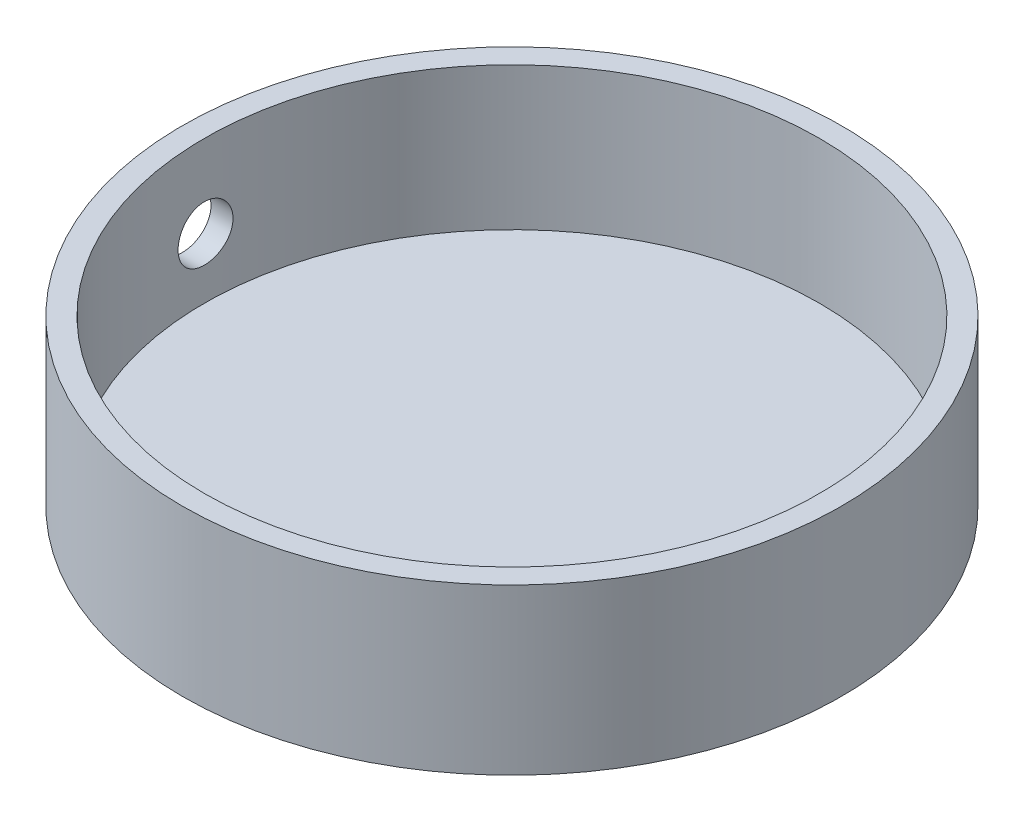
ISO-10303-21;
HEADER;
FILE_DESCRIPTION(('STEP AP214'),'2;1');
FILE_NAME('part.step','',(''),(''),'','','');
FILE_SCHEMA(('AUTOMOTIVE_DESIGN { 1 0 10303 214 1 1 1 1 }'));
ENDSEC;
DATA;
#1=APPLICATION_CONTEXT('core data for automotive mechanical design processes');
#2=APPLICATION_PROTOCOL_DEFINITION('international standard','automotive_design',2000,#1);
#3=PRODUCT_CONTEXT('',#1,'mechanical');
#4=PRODUCT('Part','Part','',(#3));
#5=PRODUCT_RELATED_PRODUCT_CATEGORY('part','',(#4));
#6=PRODUCT_DEFINITION_FORMATION('','',#4);
#7=PRODUCT_DEFINITION_CONTEXT('part definition',#1,'design');
#8=PRODUCT_DEFINITION('design','',#6,#7);
#9=PRODUCT_DEFINITION_SHAPE('','',#8);
#10=(LENGTH_UNIT() NAMED_UNIT(*) SI_UNIT(.MILLI.,.METRE.));
#11=(NAMED_UNIT(*) PLANE_ANGLE_UNIT() SI_UNIT($,.RADIAN.));
#12=(NAMED_UNIT(*) SI_UNIT($,.STERADIAN.) SOLID_ANGLE_UNIT());
#13=UNCERTAINTY_MEASURE_WITH_UNIT(LENGTH_MEASURE(1.E-05),#10,'distance_accuracy_value','');
#14=(GEOMETRIC_REPRESENTATION_CONTEXT(3) GLOBAL_UNCERTAINTY_ASSIGNED_CONTEXT((#13)) GLOBAL_UNIT_ASSIGNED_CONTEXT((#10,
#11,#12)) REPRESENTATION_CONTEXT('',''));
#15=CARTESIAN_POINT('',(0.,0.,0.));
#16=DIRECTION('',(0.,0.,1.));
#17=DIRECTION('',(1.,0.,0.));
#18=AXIS2_PLACEMENT_3D('',#15,#16,#17);
#19=CARTESIAN_POINT('',(0.,2.54,0.));
#20=DIRECTION('',(0.,-1.,0.));
#21=DIRECTION('',(0.,0.,-1.));
#22=AXIS2_PLACEMENT_3D('',#19,#20,#21);
#23=CYLINDRICAL_SURFACE('',#22,38.1);
#24=CARTESIAN_POINT('',(-37.9674778593469,9.525,3.175));
#25=CARTESIAN_POINT('',(-37.9674796148514,9.34699137458613,3.174992223886));
#26=CARTESIAN_POINT('',(-37.9687432124492,9.16886156393523,3.15997936696993));
#27=CARTESIAN_POINT('',(-37.9736610260084,8.8175305603963,3.10031123355847));
#28=CARTESIAN_POINT('',(-37.9773179506743,8.64433518421718,3.05562236969804));
#29=CARTESIAN_POINT('',(-37.9866053672742,8.30801235230677,2.93790365154258));
#30=CARTESIAN_POINT('',(-37.9922347401668,8.14487924946928,2.86488986449255));
#31=CARTESIAN_POINT('',(-38.0048313657024,7.83322285520727,2.69262246744107));
#32=CARTESIAN_POINT('',(-38.0117983322355,7.68469644967991,2.59337446720523));
#33=CARTESIAN_POINT('',(-38.0263052267685,7.40604944026374,2.37118060325433));
#34=CARTESIAN_POINT('',(-38.033846422922,7.27597150383517,2.24818130945098));
#35=CARTESIAN_POINT('',(-38.0486404573867,7.03828041719418,1.98208938314658));
#36=CARTESIAN_POINT('',(-38.0558932830884,6.9306682484669,1.83899587322542));
#37=CARTESIAN_POINT('',(-38.0693053861151,6.74082149846665,1.53652297885541));
#38=CARTESIAN_POINT('',(-38.0754630672337,6.65862383289891,1.3771203474996));
#39=CARTESIAN_POINT('',(-38.0859774147697,6.52217551569877,1.04671622158357));
#40=CARTESIAN_POINT('',(-38.0903341127107,6.4679243749007,0.875714930101314));
#41=CARTESIAN_POINT('',(-38.0967467506223,6.38903191375709,0.527392252134301));
#42=CARTESIAN_POINT('',(-38.0988080535635,6.36432156419576,0.350086600537621));
#43=CARTESIAN_POINT('',(-38.1004158213116,6.34499872988893,-0.00616674500017561));
#44=CARTESIAN_POINT('',(-38.0999623328846,6.35038568544306,-0.185114408344066));
#45=CARTESIAN_POINT('',(-38.0965960392816,6.39104808966951,-0.539104051072236));
#46=CARTESIAN_POINT('',(-38.0936893421403,6.42624930712834,-0.714154623480079));
#47=CARTESIAN_POINT('',(-38.0857505953842,6.52542557930463,-1.05585407967778));
#48=CARTESIAN_POINT('',(-38.0807185255475,6.5894009077941,-1.22250288351202));
#49=CARTESIAN_POINT('',(-38.0690846412153,6.74439210910145,-1.54290446002202));
#50=CARTESIAN_POINT('',(-38.0624808988053,6.83544122685107,-1.69664107794224));
#51=CARTESIAN_POINT('',(-38.0484457872987,7.04197131601212,-1.98667794141065));
#52=CARTESIAN_POINT('',(-38.0410144014161,7.15745278300083,-2.12297783318834));
#53=CARTESIAN_POINT('',(-38.0261325057258,7.40998784685792,-2.37470621318252));
#54=CARTESIAN_POINT('',(-38.0186820064471,7.54710594594971,-2.49007000291146));
#55=CARTESIAN_POINT('',(-38.004624326273,7.83879720374434,-2.69615157657959));
#56=CARTESIAN_POINT('',(-37.9980171460728,7.9933703768359,-2.78686934020215));
#57=CARTESIAN_POINT('',(-37.9863929785793,8.31562944367547,-2.94108125458357));
#58=CARTESIAN_POINT('',(-37.9813761874431,8.48331695175639,-3.00457204753267));
#59=CARTESIAN_POINT('',(-37.9735046116394,8.82702297981192,-3.10247984731552));
#60=CARTESIAN_POINT('',(-37.9706497815191,9.00304132455762,-3.136897465381));
#61=CARTESIAN_POINT('',(-37.967432729465,9.35784636731306,-3.17560002074756));
#62=CARTESIAN_POINT('',(-37.9670630442666,9.53662315889387,-3.17997518092429));
#63=CARTESIAN_POINT('',(-37.9688384390387,9.89236764108758,-3.15870496351731));
#64=CARTESIAN_POINT('',(-37.9709834955532,10.069335348559,-3.13305986594426));
#65=CARTESIAN_POINT('',(-37.9775398735957,10.4161791796636,-3.05255231894487));
#66=CARTESIAN_POINT('',(-37.981947928906,10.5860651434328,-2.9977319743915));
#67=CARTESIAN_POINT('',(-37.9925309166027,10.9142278608699,-2.86047288657974));
#68=CARTESIAN_POINT('',(-37.9987058773396,11.072504428211,-2.77803370016694));
#69=CARTESIAN_POINT('',(-38.0121450024561,11.3733683257962,-2.58764877433316));
#70=CARTESIAN_POINT('',(-38.0194117192607,11.515917495165,-2.47964291244999));
#71=CARTESIAN_POINT('',(-38.0342069443175,11.7808944623792,-2.24127735771924));
#72=CARTESIAN_POINT('',(-38.0417354570727,11.9033219139154,-2.11091728021842));
#73=CARTESIAN_POINT('',(-38.0562282152053,12.1248881383199,-1.83115385899478));
#74=CARTESIAN_POINT('',(-38.0631910120889,12.2239682907849,-1.68170400390121));
#75=CARTESIAN_POINT('',(-38.0757469329061,12.3956251755674,-1.36823511345573));
#76=CARTESIAN_POINT('',(-38.0813400705265,12.4682021727302,-1.20421622371214));
#77=CARTESIAN_POINT('',(-38.0905198062144,12.584691881671,-0.866475212585344));
#78=CARTESIAN_POINT('',(-38.0941089410165,12.628640843588,-0.692765665902922));
#79=CARTESIAN_POINT('',(-38.0988865697221,12.6867454092692,-0.340401843535497));
#80=CARTESIAN_POINT('',(-38.1000751090659,12.7009015769738,-0.161747661511104));
#81=CARTESIAN_POINT('',(-38.0999176999798,12.6990121317669,0.19485625365699));
#82=CARTESIAN_POINT('',(-38.0985794181538,12.6830578766626,0.372806481371152));
#83=CARTESIAN_POINT('',(-38.0935339028085,12.6215909794259,0.723490780794735));
#84=CARTESIAN_POINT('',(-38.0898266660717,12.5760782971463,0.896224845419091));
#85=CARTESIAN_POINT('',(-38.0804591990999,12.4568096998615,1.23157947247479));
#86=CARTESIAN_POINT('',(-38.0747990823492,12.3830554259817,1.39420062193183));
#87=CARTESIAN_POINT('',(-38.0621590787552,12.2094077458623,1.7047672689544));
#88=CARTESIAN_POINT('',(-38.055179212783,12.1095147529846,1.85271299854823));
#89=CARTESIAN_POINT('',(-38.0406579324267,11.8860823528541,2.13019668392583));
#90=CARTESIAN_POINT('',(-38.0331149513177,11.7624753467747,2.25968012625115));
#91=CARTESIAN_POINT('',(-38.0183309031221,11.4952457142951,2.49611459932655));
#92=CARTESIAN_POINT('',(-38.0110899095966,11.3516182476868,2.60306016549813));
#93=CARTESIAN_POINT('',(-37.9977149749742,11.0481459227745,2.79152787825786));
#94=CARTESIAN_POINT('',(-37.9915831336506,10.888271181246,2.87300201198062));
#95=CARTESIAN_POINT('',(-37.981146402472,10.5571688883677,3.00784546046481));
#96=CARTESIAN_POINT('',(-37.9768394132918,10.3859546458255,3.0612470872011));
#97=CARTESIAN_POINT('',(-37.9716477099589,10.0989419425786,3.1248289611693));
#98=CARTESIAN_POINT('',(-37.9700912043147,9.98498938742769,3.14361809063546));
#99=CARTESIAN_POINT('',(-37.9680057114582,9.75570818992021,3.16870611338372));
#100=CARTESIAN_POINT('',(-37.9674767214846,9.64037955126236,3.17500504023073));
#101=CARTESIAN_POINT('',(-37.9674778593469,9.525,3.175));
#102=B_SPLINE_CURVE_WITH_KNOTS('',3,(#24,#25,#26,#27,#28,#29,#30,#31,#32,#33,#34,#35,#36,#37,
#38,#39,#40,#41,#42,#43,#44,#45,#46,#47,#48,#49,#50,#51,#52,#53,#54,#55,#56,#57,#58,#59,#60,#61,
#62,#63,#64,#65,#66,#67,#68,#69,#70,#71,#72,#73,#74,#75,#76,#77,#78,#79,#80,#81,#82,#83,#84,#85,
#86,#87,#88,#89,#90,#91,#92,#93,#94,#95,#96,#97,#98,#99,#100,#101),.UNSPECIFIED.,.T.,.F.,(4,2,2,
2,2,2,2,2,2,2,2,2,2,2,2,2,2,2,2,2,2,2,2,2,2,2,2,2,2,2,2,2,2,2,2,2,2,2,4),(0.,0.533604603517507,
1.06781417349037,1.60172115641093,2.13551406411709,2.67052206526965,3.2055534349789,
3.74135834978334,4.27715388573729,4.81169494296257,5.34622605970216,5.87943020597204,
6.41263942553356,6.94650611589526,7.4803836360617,8.01588389273743,8.55138459084428,
9.08695131145285,9.62250677207596,10.1564531576629,10.6903945629631,11.2235674807547,
11.7567489539102,12.2911969327788,12.8256541089181,13.3614392326626,13.8972190021753,
14.4323190169852,14.9674089029308,15.5008778862256,16.0343475940937,16.5677863066157,
17.1012165837663,17.6361906712906,18.1712943208452,18.7074006261176,19.2428885044878,
19.5887550320896,19.9346206302438),.UNSPECIFIED.);
#103=CARTESIAN_POINT('',(-37.9674778593469,9.525,3.175));
#104=VERTEX_POINT('',#103);
#105=EDGE_CURVE('E57',#104,#104,#102,.T.);
#106=ORIENTED_EDGE('',*,*,#105,.T.);
#107=EDGE_LOOP('',(#106));
#108=FACE_BOUND('',#107,.T.);
#109=CARTESIAN_POINT('',(0.,0.,0.));
#110=DIRECTION('',(0.,1.,0.));
#111=DIRECTION('',(0.,0.,1.));
#112=AXIS2_PLACEMENT_3D('',#109,#110,#111);
#113=CIRCLE('',#112,38.1);
#114=CARTESIAN_POINT('',(0.,0.,38.1));
#115=VERTEX_POINT('',#114);
#116=EDGE_CURVE('E44',#115,#115,#113,.T.);
#117=ORIENTED_EDGE('',*,*,#116,.T.);
#118=EDGE_LOOP('',(#117));
#119=FACE_BOUND('',#118,.T.);
#120=CARTESIAN_POINT('',(0.,19.05,0.));
#121=DIRECTION('',(0.,1.,0.));
#122=DIRECTION('',(0.,0.,1.));
#123=AXIS2_PLACEMENT_3D('',#120,#121,#122);
#124=CIRCLE('',#123,38.1);
#125=CARTESIAN_POINT('',(0.,19.05,38.1));
#126=VERTEX_POINT('',#125);
#127=EDGE_CURVE('E48',#126,#126,#124,.T.);
#128=ORIENTED_EDGE('',*,*,#127,.F.);
#129=EDGE_LOOP('',(#128));
#130=FACE_BOUND('',#129,.T.);
#131=ADVANCED_FACE('F37',(#108,#119,#130),#23,.T.);
#132=CARTESIAN_POINT('',(0.,0.,0.));
#133=DIRECTION('',(0.,1.,0.));
#134=DIRECTION('',(0.,0.,1.));
#135=AXIS2_PLACEMENT_3D('',#132,#133,#134);
#136=PLANE('',#135);
#137=ORIENTED_EDGE('',*,*,#116,.F.);
#138=EDGE_LOOP('',(#137));
#139=FACE_BOUND('',#138,.T.);
#140=ADVANCED_FACE('F84',(#139),#136,.F.);
#141=CARTESIAN_POINT('',(0.,19.05,0.));
#142=DIRECTION('',(0.,1.,0.));
#143=DIRECTION('',(0.,0.,1.));
#144=AXIS2_PLACEMENT_3D('',#141,#142,#143);
#145=PLANE('',#144);
#146=ORIENTED_EDGE('',*,*,#127,.T.);
#147=EDGE_LOOP('',(#146));
#148=FACE_BOUND('',#147,.T.);
#149=CARTESIAN_POINT('',(0.,19.05,0.));
#150=DIRECTION('',(0.,1.,0.));
#151=DIRECTION('',(0.,0.,1.));
#152=AXIS2_PLACEMENT_3D('',#149,#150,#151);
#153=CIRCLE('',#152,35.56);
#154=CARTESIAN_POINT('',(0.,19.05,35.56));
#155=VERTEX_POINT('',#154);
#156=EDGE_CURVE('E52',#155,#155,#153,.T.);
#157=ORIENTED_EDGE('',*,*,#156,.F.);
#158=EDGE_LOOP('',(#157));
#159=FACE_BOUND('',#158,.T.);
#160=ADVANCED_FACE('F80',(#148,#159),#145,.T.);
#161=CARTESIAN_POINT('',(0.,19.05,0.));
#162=DIRECTION('',(0.,-1.,0.));
#163=DIRECTION('',(0.,0.,-1.));
#164=AXIS2_PLACEMENT_3D('',#161,#162,#163);
#165=CYLINDRICAL_SURFACE('',#164,35.56);
#166=CARTESIAN_POINT('',(-35.4179753091562,9.525,3.175));
#167=CARTESIAN_POINT('',(-35.4179771839054,9.70295937246068,3.17499224704364));
#168=CARTESIAN_POINT('',(-35.4193310012786,9.88103872575564,3.15998765922318));
#169=CARTESIAN_POINT('',(-35.4245997090414,10.2322668192029,3.10035429888846));
#170=CARTESIAN_POINT('',(-35.4285174745342,10.4054097961834,3.05569226894318));
#171=CARTESIAN_POINT('',(-35.4384668385406,10.7416275501285,2.93804899954127));
#172=CARTESIAN_POINT('',(-35.4444972105276,10.9047081046096,2.86508418934127));
#173=CARTESIAN_POINT('',(-35.4579907921037,11.2162697434152,2.69293659649378));
#174=CARTESIAN_POINT('',(-35.4654537026094,11.3647538653955,2.59375928483055));
#175=CARTESIAN_POINT('',(-35.4809959804468,11.643379904514,2.37168905981367));
#176=CARTESIAN_POINT('',(-35.4890768990171,11.7734731645619,2.24873520050949));
#177=CARTESIAN_POINT('',(-35.5049305177298,12.0112062400863,1.98273155882221));
#178=CARTESIAN_POINT('',(-35.5127032041823,12.1188450591706,1.83968088513525));
#179=CARTESIAN_POINT('',(-35.5270795306832,12.3087781290069,1.53725099597545));
#180=CARTESIAN_POINT('',(-35.5336812035478,12.391029900423,1.37784500100847));
#181=CARTESIAN_POINT('',(-35.5449548940822,12.5275823283594,1.04741591449028));
#182=CARTESIAN_POINT('',(-35.549626949979,12.5818835386048,0.876393053155366));
#183=CARTESIAN_POINT('',(-35.556504133028,12.6608523285856,0.528072222383959));
#184=CARTESIAN_POINT('',(-35.5587158527205,12.6855991134129,0.350792341974649));
#185=CARTESIAN_POINT('',(-35.5604455332635,12.705001508395,-0.00541753863674558));
#186=CARTESIAN_POINT('',(-35.5599635508588,12.6996577524294,-0.184347503999291));
#187=CARTESIAN_POINT('',(-35.5563655576214,12.6590953672557,-0.538241124555074));
#188=CARTESIAN_POINT('',(-35.553257056309,12.6239619092394,-0.713214628836473));
#189=CARTESIAN_POINT('',(-35.5447641950099,12.5249499485285,-1.05477127359604));
#190=CARTESIAN_POINT('',(-35.5393798106724,12.4610711382721,-1.22135432427909));
#191=CARTESIAN_POINT('',(-35.5269278756207,12.3062873508177,-1.54167154815832));
#192=CARTESIAN_POINT('',(-35.5198579616385,12.2153443823262,-1.69538726760003));
#193=CARTESIAN_POINT('',(-35.5048290720375,12.0090413991896,-1.98540500908727));
#194=CARTESIAN_POINT('',(-35.4968700756788,11.8936808148944,-2.12170662475212));
#195=CARTESIAN_POINT('',(-35.4809242690942,11.6413375769712,-2.37352533851665));
#196=CARTESIAN_POINT('',(-35.4729374587134,11.5042808868934,-2.48896825881098));
#197=CARTESIAN_POINT('',(-35.4578640417151,11.2126935421646,-2.69521909666099));
#198=CARTESIAN_POINT('',(-35.4507774360092,11.0581628698192,-2.78602698927073));
#199=CARTESIAN_POINT('',(-35.4383057321389,10.735960380267,-2.94042807374574));
#200=CARTESIAN_POINT('',(-35.4329208900856,10.5682865897884,-3.00401716976028));
#201=CARTESIAN_POINT('',(-35.4244675468025,10.2245834702845,-3.10211941189158));
#202=CARTESIAN_POINT('',(-35.4213989895545,10.0485543434387,-3.13663326118226));
#203=CARTESIAN_POINT('',(-35.4179349736374,9.69378717110346,-3.17551087560328));
#204=CARTESIAN_POINT('',(-35.4175303340218,9.51506055958746,-3.17997819448483));
#205=CARTESIAN_POINT('',(-35.4194157400483,9.15940110179092,-3.15890742967948));
#206=CARTESIAN_POINT('',(-35.4217057567756,8.98246823628325,-3.13336966796017));
#207=CARTESIAN_POINT('',(-35.4287140859439,8.63571756235503,-3.05310009887985));
#208=CARTESIAN_POINT('',(-35.4334283604258,8.46588842867933,-2.9984168321546));
#209=CARTESIAN_POINT('',(-35.4447507065915,8.13781481567846,-2.86145792618189));
#210=CARTESIAN_POINT('',(-35.4513588130643,7.9795705492293,-2.77918178006055));
#211=CARTESIAN_POINT('',(-35.4657465095383,7.67868540217121,-2.58911148159999));
#212=CARTESIAN_POINT('',(-35.473529240537,7.53608818357481,-2.48124845278859));
#213=CARTESIAN_POINT('',(-35.4893787702651,7.27098672541199,-2.24316544441566));
#214=CARTESIAN_POINT('',(-35.4974455745985,7.14848288251174,-2.11294502359753));
#215=CARTESIAN_POINT('',(-35.5129817962104,6.92669092025692,-1.83339563071016));
#216=CARTESIAN_POINT('',(-35.5204494396628,6.82747017447843,-1.68401309285807));
#217=CARTESIAN_POINT('',(-35.5339202911204,6.65552364379057,-1.37064599983836));
#218=CARTESIAN_POINT('',(-35.5399235156088,6.58279756066055,-1.20666160905324));
#219=CARTESIAN_POINT('',(-35.549781021086,6.46601996797329,-0.868985040542095));
#220=CARTESIAN_POINT('',(-35.5536383987088,6.42192712282599,-0.695307251817805));
#221=CARTESIAN_POINT('',(-35.5587822099152,6.36353260547088,-0.342977479977632));
#222=CARTESIAN_POINT('',(-35.5600687000856,6.34923027755646,-0.164325606431957));
#223=CARTESIAN_POINT('',(-35.5599258330592,6.35083095056275,0.192217756502831));
#224=CARTESIAN_POINT('',(-35.5585059040804,6.36662909190259,0.370109729793587));
#225=CARTESIAN_POINT('',(-35.5531283629254,6.4277631739904,0.720702755000365));
#226=CARTESIAN_POINT('',(-35.549170747744,6.47309914971818,0.893403800768843));
#227=CARTESIAN_POINT('',(-35.5391616576081,6.59199448696046,1.22871679483775));
#228=CARTESIAN_POINT('',(-35.5331103531535,6.66555155033979,1.39132956340719));
#229=CARTESIAN_POINT('',(-35.5195900486862,6.83878939242093,1.70191559675198));
#230=CARTESIAN_POINT('',(-35.5121210663082,6.93846984617626,1.84988904359299));
#231=CARTESIAN_POINT('',(-35.4965721587986,7.16151869480571,2.1275331007277));
#232=CARTESIAN_POINT('',(-35.4884902808094,7.28496491609571,2.25714107905497));
#233=CARTESIAN_POINT('',(-35.4726430908514,7.5518949998537,2.49385362014298));
#234=CARTESIAN_POINT('',(-35.4648778557736,7.69538369227037,2.6009527429634));
#235=CARTESIAN_POINT('',(-35.4505256139435,7.99864412356506,2.78977549088274));
#236=CARTESIAN_POINT('',(-35.4439411099071,8.15844934883177,2.8714454790135));
#237=CARTESIAN_POINT('',(-35.4327260995808,8.48945683921328,3.00668734006527));
#238=CARTESIAN_POINT('',(-35.4280933622535,8.66064583099732,3.060291311977));
#239=CARTESIAN_POINT('',(-35.4224901194444,8.94819283840546,3.12432279142109));
#240=CARTESIAN_POINT('',(-35.4208049232448,9.06270504105636,3.14330124550117));
#241=CARTESIAN_POINT('',(-35.4185469090542,9.29312785056228,3.16864235577113));
#242=CARTESIAN_POINT('',(-35.4179740875357,9.40903845298169,3.17500505196665));
#243=CARTESIAN_POINT('',(-35.4179753091562,9.525,3.175));
#244=B_SPLINE_CURVE_WITH_KNOTS('',3,(#166,#167,#168,#169,#170,#171,#172,#173,#174,#175,#176,
#177,#178,#179,#180,#181,#182,#183,#184,#185,#186,#187,#188,#189,#190,#191,#192,#193,#194,#195,
#196,#197,#198,#199,#200,#201,#202,#203,#204,#205,#206,#207,#208,#209,#210,#211,#212,#213,#214,
#215,#216,#217,#218,#219,#220,#221,#222,#223,#224,#225,#226,#227,#228,#229,#230,#231,#232,#233,
#234,#235,#236,#237,#238,#239,#240,#241,#242,#243),.UNSPECIFIED.,.T.,.F.,(4,2,2,2,2,2,2,2,2,2,2,
2,2,2,2,2,2,2,2,2,2,2,2,2,2,2,2,2,2,2,2,2,2,2,2,2,2,2,4),(0.,0.533454695715621,1.0675086123868,
1.60125298314029,2.13488604043496,2.66990552758807,3.20494875062031,3.74088245072274,
4.27680553310003,4.81128910924398,5.34576142613655,5.87871077575802,6.41166582782247,
6.94537257273606,7.47909177011441,8.01467314833388,8.55025506889207,9.08591755484426,
9.62156708562874,10.1553695788933,10.6891663442767,11.2220768584769,11.7549971626386,
12.2893686299736,12.8237506451422,13.3596604247672,13.8955641720714,14.4306925465446,
14.9658091424071,15.4990649857001,16.0323214604957,16.565534519692,17.0987409466142,
17.6337241301541,18.1688364601289,18.7050699590088,19.2406888226911,19.5882986568287,
19.9359073886646),.UNSPECIFIED.);
#245=CARTESIAN_POINT('',(-35.4179753091562,9.525,3.175));
#246=VERTEX_POINT('',#245);
#247=EDGE_CURVE('E64',#246,#246,#244,.T.);
#248=ORIENTED_EDGE('',*,*,#247,.T.);
#249=EDGE_LOOP('',(#248));
#250=FACE_BOUND('',#249,.T.);
#251=ORIENTED_EDGE('',*,*,#156,.T.);
#252=EDGE_LOOP('',(#251));
#253=FACE_BOUND('',#252,.T.);
#254=CARTESIAN_POINT('',(0.,2.54,0.));
#255=DIRECTION('',(0.,1.,0.));
#256=DIRECTION('',(0.,0.,1.));
#257=AXIS2_PLACEMENT_3D('',#254,#255,#256);
#258=CIRCLE('',#257,35.56);
#259=CARTESIAN_POINT('',(0.,2.54,35.56));
#260=VERTEX_POINT('',#259);
#261=EDGE_CURVE('E10',#260,#260,#258,.F.);
#262=ORIENTED_EDGE('',*,*,#261,.T.);
#263=EDGE_LOOP('',(#262));
#264=FACE_BOUND('',#263,.T.);
#265=ADVANCED_FACE('F76',(#250,#253,#264),#165,.F.);
#266=CARTESIAN_POINT('',(0.,2.54,0.));
#267=DIRECTION('',(0.,1.,0.));
#268=DIRECTION('',(0.,0.,1.));
#269=AXIS2_PLACEMENT_3D('',#266,#267,#268);
#270=PLANE('',#269);
#271=ORIENTED_EDGE('',*,*,#261,.F.);
#272=EDGE_LOOP('',(#271));
#273=FACE_BOUND('',#272,.T.);
#274=ADVANCED_FACE('F73',(#273),#270,.T.);
#275=CARTESIAN_POINT('',(38.101,9.525,0.));
#276=DIRECTION('',(-1.,0.,0.));
#277=DIRECTION('',(0.,0.,1.));
#278=AXIS2_PLACEMENT_3D('',#275,#276,#277);
#279=CYLINDRICAL_SURFACE('',#278,3.175);
#280=ORIENTED_EDGE('',*,*,#247,.F.);
#281=EDGE_LOOP('',(#280));
#282=FACE_BOUND('',#281,.T.);
#283=ORIENTED_EDGE('',*,*,#105,.F.);
#284=EDGE_LOOP('',(#283));
#285=FACE_BOUND('',#284,.T.);
#286=ADVANCED_FACE('F69',(#282,#285),#279,.F.);
#287=CLOSED_SHELL('',(#131,#140,#160,#265,#274,#286));
#288=MANIFOLD_SOLID_BREP('B2',#287);
#289=ADVANCED_BREP_SHAPE_REPRESENTATION('',(#18,#288),#14);
#290=SHAPE_DEFINITION_REPRESENTATION(#9,#289);
ENDSEC;
END-ISO-10303-21;
